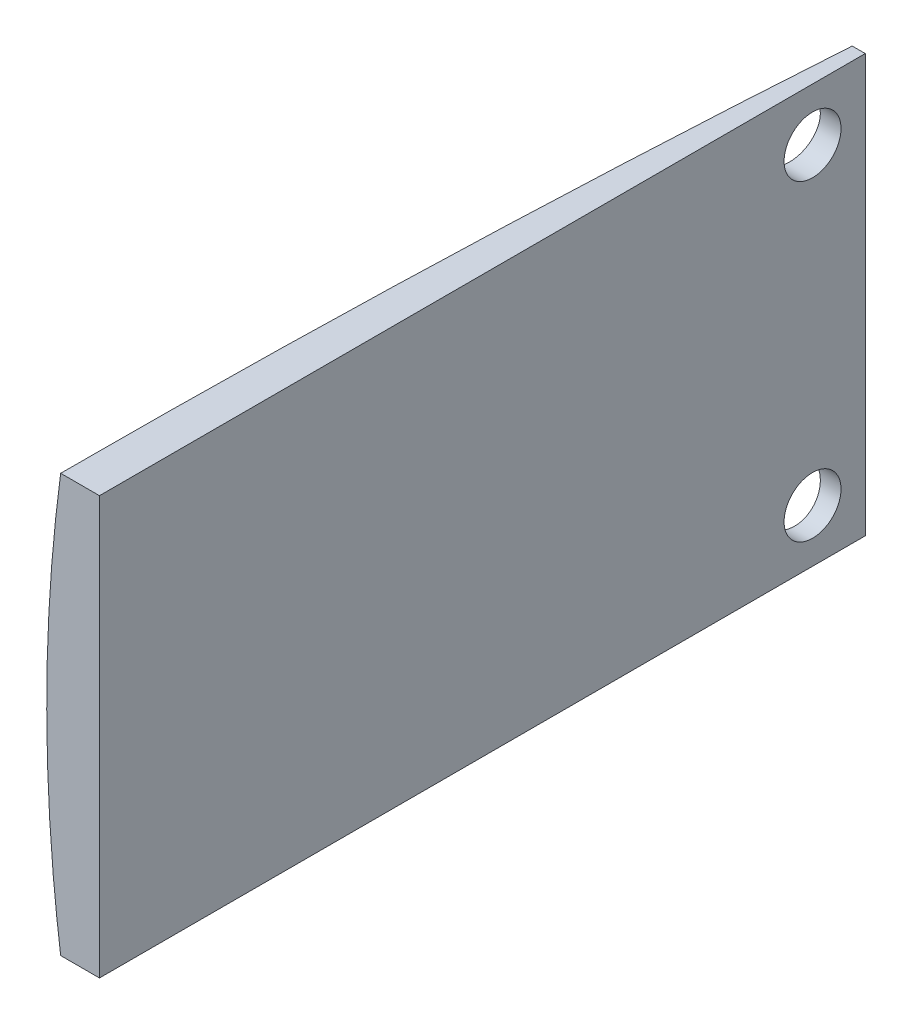
ISO-10303-21;
HEADER;
FILE_DESCRIPTION(('STEP AP214'),'2;1');
FILE_NAME('part.step','',(''),(''),'','','');
FILE_SCHEMA(('AUTOMOTIVE_DESIGN { 1 0 10303 214 1 1 1 1 }'));
ENDSEC;
DATA;
#1=APPLICATION_CONTEXT('core data for automotive mechanical design processes');
#2=APPLICATION_PROTOCOL_DEFINITION('international standard','automotive_design',2000,#1);
#3=PRODUCT_CONTEXT('',#1,'mechanical');
#4=PRODUCT('Part','Part','',(#3));
#5=PRODUCT_RELATED_PRODUCT_CATEGORY('part','',(#4));
#6=PRODUCT_DEFINITION_FORMATION('','',#4);
#7=PRODUCT_DEFINITION_CONTEXT('part definition',#1,'design');
#8=PRODUCT_DEFINITION('design','',#6,#7);
#9=PRODUCT_DEFINITION_SHAPE('','',#8);
#10=(LENGTH_UNIT() NAMED_UNIT(*) SI_UNIT(.MILLI.,.METRE.));
#11=(NAMED_UNIT(*) PLANE_ANGLE_UNIT() SI_UNIT($,.RADIAN.));
#12=(NAMED_UNIT(*) SI_UNIT($,.STERADIAN.) SOLID_ANGLE_UNIT());
#13=UNCERTAINTY_MEASURE_WITH_UNIT(LENGTH_MEASURE(1.E-05),#10,'distance_accuracy_value','');
#14=(GEOMETRIC_REPRESENTATION_CONTEXT(3) GLOBAL_UNCERTAINTY_ASSIGNED_CONTEXT((#13)) GLOBAL_UNIT_ASSIGNED_CONTEXT((#10,
#11,#12)) REPRESENTATION_CONTEXT('',''));
#15=CARTESIAN_POINT('',(0.,0.,0.));
#16=DIRECTION('',(0.,0.,1.));
#17=DIRECTION('',(1.,0.,0.));
#18=AXIS2_PLACEMENT_3D('',#15,#16,#17);
#19=CARTESIAN_POINT('',(-1.2E-05,25.146,0.));
#20=DIRECTION('',(0.,1.,0.));
#21=DIRECTION('',(0.,0.,1.));
#22=AXIS2_PLACEMENT_3D('',#19,#20,#21);
#23=PLANE('',#22);
#24=CARTESIAN_POINT('',(1372.87,25.1460000000003,0.));
#25=DIRECTION('',(0.,-1.,0.));
#26=DIRECTION('',(1.,0.,0.));
#27=AXIS2_PLACEMENT_3D('',#24,#25,#26);
#28=CIRCLE('',#27,1371.19541959824);
#29=CARTESIAN_POINT('',(4.7780184712767,25.146,-92.2019999999999));
#30=VERTEX_POINT('',#29);
#31=CARTESIAN_POINT('',(1.67458040176172,25.146,0.));
#32=VERTEX_POINT('',#31);
#33=EDGE_CURVE('E94',#30,#32,#28,.F.);
#34=ORIENTED_EDGE('',*,*,#33,.T.);
#35=DIRECTION('',(1.,0.,0.));
#36=VECTOR('',#35,1.);
#37=CARTESIAN_POINT('',(-1.2E-05,25.146,0.));
#38=LINE('',#37,#36);
#39=CARTESIAN_POINT('',(6.35,25.146,0.));
#40=VERTEX_POINT('',#39);
#41=EDGE_CURVE('E127',#32,#40,#38,.T.);
#42=ORIENTED_EDGE('',*,*,#41,.T.);
#43=DIRECTION('',(0.,0.,1.));
#44=VECTOR('',#43,1.);
#45=CARTESIAN_POINT('',(6.35,25.146,-92.2020000000001));
#46=LINE('',#45,#44);
#47=CARTESIAN_POINT('',(6.35,25.146,-92.2020000000001));
#48=VERTEX_POINT('',#47);
#49=EDGE_CURVE('E135',#48,#40,#46,.T.);
#50=ORIENTED_EDGE('',*,*,#49,.F.);
#51=DIRECTION('',(1.,0.,0.));
#52=VECTOR('',#51,1.);
#53=CARTESIAN_POINT('',(-1.2E-05,25.146,-92.2019999999999));
#54=LINE('',#53,#52);
#55=EDGE_CURVE('E145',#30,#48,#54,.T.);
#56=ORIENTED_EDGE('',*,*,#55,.F.);
#57=EDGE_LOOP('',(#34,#42,#50,#56));
#58=FACE_BOUND('',#57,.T.);
#59=ADVANCED_FACE('F84',(#58),#23,.T.);
#60=CARTESIAN_POINT('',(-1.2E-05,-25.146,0.));
#61=DIRECTION('',(0.,1.,0.));
#62=DIRECTION('',(0.,0.,1.));
#63=AXIS2_PLACEMENT_3D('',#60,#61,#62);
#64=PLANE('',#63);
#65=DIRECTION('',(1.,0.,0.));
#66=VECTOR('',#65,1.);
#67=CARTESIAN_POINT('',(-1.2E-05,-25.146,0.));
#68=LINE('',#67,#66);
#69=CARTESIAN_POINT('',(1.67458040176194,-25.146,0.));
#70=VERTEX_POINT('',#69);
#71=CARTESIAN_POINT('',(6.35,-25.146,0.));
#72=VERTEX_POINT('',#71);
#73=EDGE_CURVE('E100',#70,#72,#68,.T.);
#74=ORIENTED_EDGE('',*,*,#73,.F.);
#75=CARTESIAN_POINT('',(1372.87,-25.1459999999997,0.));
#76=DIRECTION('',(0.,-1.,0.));
#77=DIRECTION('',(1.,0.,0.));
#78=AXIS2_PLACEMENT_3D('',#75,#76,#77);
#79=CIRCLE('',#78,1371.19541959824);
#80=CARTESIAN_POINT('',(4.77801847127712,-25.1459999999997,-92.2019999999999));
#81=VERTEX_POINT('',#80);
#82=EDGE_CURVE('E151',#81,#70,#79,.F.);
#83=ORIENTED_EDGE('',*,*,#82,.F.);
#84=DIRECTION('',(1.,0.,0.));
#85=VECTOR('',#84,1.);
#86=CARTESIAN_POINT('',(-1.2E-05,-25.146,-92.2019999999999));
#87=LINE('',#86,#85);
#88=CARTESIAN_POINT('',(6.35,-25.146,-92.2020000000001));
#89=VERTEX_POINT('',#88);
#90=EDGE_CURVE('E142',#81,#89,#87,.T.);
#91=ORIENTED_EDGE('',*,*,#90,.T.);
#92=DIRECTION('',(0.,0.,-1.));
#93=VECTOR('',#92,1.);
#94=CARTESIAN_POINT('',(6.35,-25.146,-92.2020000000001));
#95=LINE('',#94,#93);
#96=EDGE_CURVE('E147',#72,#89,#95,.T.);
#97=ORIENTED_EDGE('',*,*,#96,.F.);
#98=EDGE_LOOP('',(#74,#83,#91,#97));
#99=FACE_BOUND('',#98,.T.);
#100=ADVANCED_FACE('F168',(#99),#64,.F.);
#101=CARTESIAN_POINT('',(1372.87,4.16333634234434E-13,0.));
#102=DIRECTION('',(0.,0.,1.));
#103=DIRECTION('',(-1.,0.,0.));
#104=AXIS2_PLACEMENT_3D('',#101,#102,#103);
#105=ELLIPSE('',#104,1372.87,509.27);
#106=TRIMMED_CURVE('',#105,(PARAMETER_VALUE(4.71238898038469)),
(PARAMETER_VALUE(7.85398163397448)),.T.,.PARAMETER.);
#107=CARTESIAN_POINT('',(1372.87,-509.27,0.));
#108=DIRECTION('',(0.,-1.,0.));
#109=AXIS1_PLACEMENT('',#107,#108);
#110=SURFACE_OF_REVOLUTION('',#106,#109);
#111=CARTESIAN_POINT('',(3.84350644112894,-18.7960000000001,-89.2810000000001));
#112=CARTESIAN_POINT('',(3.82416979745418,-18.6021967518642,-89.2809913131429));
#113=CARTESIAN_POINT('',(3.80405403535252,-18.408325517274,-89.2645149146861));
#114=CARTESIAN_POINT('',(3.76282676595103,-18.0260814130698,-89.1990814083742));
#115=CARTESIAN_POINT('',(3.74171403802477,-17.837715766031,-89.1500834722642));
#116=CARTESIAN_POINT('',(3.69905601555515,-17.4720901472664,-89.021045271072));
#117=CARTESIAN_POINT('',(3.67751097428364,-17.294823910099,-88.9410227057759));
#118=CARTESIAN_POINT('',(3.63449777940847,-16.956377174898,-88.7522365646787));
#119=CARTESIAN_POINT('',(3.61302960735217,-16.7951925264427,-88.6434804311602));
#120=CARTESIAN_POINT('',(3.57062681355467,-16.4932591267592,-88.4001483641188));
#121=CARTESIAN_POINT('',(3.54969284158904,-16.3525343683172,-88.2655425396562));
#122=CARTESIAN_POINT('',(3.50884976266647,-16.0957840424969,-87.9743921720791));
#123=CARTESIAN_POINT('',(3.48894069579336,-15.9797594405814,-87.8178467718022));
#124=CARTESIAN_POINT('',(3.45062417577412,-15.7759495494466,-87.4875239872384));
#125=CARTESIAN_POINT('',(3.43221436988144,-15.6881193524145,-87.3137745888402));
#126=CARTESIAN_POINT('',(3.3972855095271,-15.5430310464798,-86.9537691209872));
#127=CARTESIAN_POINT('',(3.380766417403,-15.4857723285193,-86.7675133007737));
#128=CARTESIAN_POINT('',(3.35008592376041,-15.4037203795928,-86.3885750550185));
#129=CARTESIAN_POINT('',(3.33591540430273,-15.3787989005092,-86.1959211435209));
#130=CARTESIAN_POINT('',(3.31023180340657,-15.3618059998273,-85.8089927785232));
#131=CARTESIAN_POINT('',(3.29871864489868,-15.3697336254051,-85.6147183721903));
#132=CARTESIAN_POINT('',(3.27875079386526,-15.418167435771,-85.2311425755838));
#133=CARTESIAN_POINT('',(3.2702805079979,-15.4585039906361,-85.0418205781691));
#134=CARTESIAN_POINT('',(3.25661671873342,-15.5704563910622,-84.6725375020955));
#135=CARTESIAN_POINT('',(3.25142312268059,-15.6420713520596,-84.4925761588752));
#136=CARTESIAN_POINT('',(3.24457219734608,-15.8141463857437,-84.1480366813344));
#137=CARTESIAN_POINT('',(3.24289786438313,-15.9144650873139,-83.983388269586));
#138=CARTESIAN_POINT('',(3.24319794834599,-16.1412337785769,-83.6732009837098));
#139=CARTESIAN_POINT('',(3.24517228839113,-16.2676832176227,-83.5276617070053));
#140=CARTESIAN_POINT('',(3.25282782939993,-16.5427290946912,-83.2601829428099));
#141=CARTESIAN_POINT('',(3.25849940006001,-16.6912672238215,-83.1381832080403));
#142=CARTESIAN_POINT('',(3.27349730518516,-17.0064809541096,-82.9207333783765));
#143=CARTESIAN_POINT('',(3.28282363772124,-17.1731565456944,-82.8252832694694));
#144=CARTESIAN_POINT('',(3.30498094945711,-17.520107410769,-82.6634537908069));
#145=CARTESIAN_POINT('',(3.31781635581612,-17.7003996540926,-82.5971114215833));
#146=CARTESIAN_POINT('',(3.34669520407488,-18.0692768236335,-82.4954363188668));
#147=CARTESIAN_POINT('',(3.36273872283217,-18.257861948441,-82.4601043284065));
#148=CARTESIAN_POINT('',(3.39771307070351,-18.6390490256929,-82.4212117203763));
#149=CARTESIAN_POINT('',(3.41665898034066,-18.8316671383574,-82.4178231876746));
#150=CARTESIAN_POINT('',(3.45683769175307,-19.2145254434208,-82.4432335056031));
#151=CARTESIAN_POINT('',(3.47807058775928,-19.404765537477,-82.4720336829673));
#152=CARTESIAN_POINT('',(3.52235548402294,-19.7790018187904,-82.5612510064372));
#153=CARTESIAN_POINT('',(3.54542001433735,-19.9629399829813,-82.6219053469163));
#154=CARTESIAN_POINT('',(3.59249956045478,-20.3179142601414,-82.7731940468349));
#155=CARTESIAN_POINT('',(3.61651461325151,-20.4889498701972,-82.8638295741347));
#156=CARTESIAN_POINT('',(3.66486142805937,-20.8143310435793,-83.0731469919832));
#157=CARTESIAN_POINT('',(3.68919422533105,-20.9685706029349,-83.1919934754542));
#158=CARTESIAN_POINT('',(3.73721964680474,-21.2548116375953,-83.454095637418));
#159=CARTESIAN_POINT('',(3.76091226174127,-21.3868127911837,-83.5973516689764));
#160=CARTESIAN_POINT('',(3.80687266779825,-21.624895441691,-83.9043957570261));
#161=CARTESIAN_POINT('',(3.8291392242454,-21.7309546963475,-84.0682012516168));
#162=CARTESIAN_POINT('',(3.87146256297029,-21.9138897248772,-84.4116339863735));
#163=CARTESIAN_POINT('',(3.89151939736879,-21.9907661871903,-84.5912608531805));
#164=CARTESIAN_POINT('',(3.92864334798174,-22.1126876211141,-84.9602674717372));
#165=CARTESIAN_POINT('',(3.94572536976943,-22.1578949374637,-85.1495920631484));
#166=CARTESIAN_POINT('',(3.97646100435481,-22.215680745214,-85.5334303364292));
#167=CARTESIAN_POINT('',(3.99011477243594,-22.2282607147179,-85.7279437828268));
#168=CARTESIAN_POINT('',(4.01346780013085,-22.2203340254297,-86.1148913839218));
#169=CARTESIAN_POINT('',(4.02319932942697,-22.2001045410049,-86.3073292749409));
#170=CARTESIAN_POINT('',(4.03860608122912,-22.127562327081,-86.686227176914));
#171=CARTESIAN_POINT('',(4.04428147050958,-22.0752509168439,-86.8726874333464));
#172=CARTESIAN_POINT('',(4.05144731267281,-21.9404669947227,-87.2329815545217));
#173=CARTESIAN_POINT('',(4.0529663582659,-21.8582049861288,-87.4068936318116));
#174=CARTESIAN_POINT('',(4.05195481242686,-21.665810151487,-87.7385247396477));
#175=CARTESIAN_POINT('',(4.04942445194082,-21.555678915181,-87.8962446931185));
#176=CARTESIAN_POINT('',(4.0405186548523,-21.3109549947946,-88.1907224815361));
#177=CARTESIAN_POINT('',(4.03415107947915,-21.1764127139631,-88.3275224583772));
#178=CARTESIAN_POINT('',(4.0178883044561,-20.8865167193227,-88.5767615725779));
#179=CARTESIAN_POINT('',(4.00799218313595,-20.7311575746907,-88.689194332775));
#180=CARTESIAN_POINT('',(3.98503779767561,-20.4034651892062,-88.8869422981466));
#181=CARTESIAN_POINT('',(3.97196758709106,-20.2310693157188,-88.9721521696573));
#182=CARTESIAN_POINT('',(3.94317136265055,-19.8748139154431,-89.1124869234037));
#183=CARTESIAN_POINT('',(3.9274484677542,-19.6909680096368,-89.1676468192129));
#184=CARTESIAN_POINT('',(3.90021478094734,-19.3876440253995,-89.2316725193735));
#185=CARTESIAN_POINT('',(3.88935278791394,-19.2700493435361,-89.2501526520728));
#186=CARTESIAN_POINT('',(3.86692698978308,-19.0336449634025,-89.2748190685457));
#187=CARTESIAN_POINT('',(3.85536318321527,-18.9148352625871,-89.2810053265617));
#188=CARTESIAN_POINT('',(3.84350644112894,-18.7960000000001,-89.2810000000001));
#189=B_SPLINE_CURVE_WITH_KNOTS('',3,(#111,#112,#113,#114,#115,#116,#117,#118,#119,#120,#121,
#122,#123,#124,#125,#126,#127,#128,#129,#130,#131,#132,#133,#134,#135,#136,#137,#138,#139,#140,
#141,#142,#143,#144,#145,#146,#147,#148,#149,#150,#151,#152,#153,#154,#155,#156,#157,#158,#159,
#160,#161,#162,#163,#164,#165,#166,#167,#168,#169,#170,#171,#172,#173,#174,#175,#176,#177,#178,
#179,#180,#181,#182,#183,#184,#185,#186,#187,#188),.UNSPECIFIED.,.T.,.F.,(4,2,2,2,2,2,2,2,2,2,2,
2,2,2,2,2,2,2,2,2,2,2,2,2,2,2,2,2,2,2,2,2,2,2,2,2,2,2,4),(0.,0.583859197381522,1.16845277439552,
1.75271332595525,2.33682269626621,2.92161160538329,3.50642336812888,4.09029897173662,
4.67416294269702,5.25570418422004,5.83722855762474,6.41572887872768,6.99421284071454,
7.56989531186605,8.14556565303274,8.71974248520838,9.29391901433181,9.8688233126767,
10.4437413857968,11.0217548824091,11.5997922040934,12.1821960792768,12.7646226435712,
13.3505346425141,13.9364551169445,14.5228762051214,15.1092834584081,15.6926621838752,
16.2760144803164,16.8544642338192,17.4328902021043,18.0073268827774,18.5817308032961,
19.1549619350964,19.7283429069699,20.3039163243784,20.8788176540056,21.2368246344548,
21.5948323649858),.UNSPECIFIED.);
#190=CARTESIAN_POINT('',(3.84350644112894,-18.7960000000001,-89.2810000000001));
#191=VERTEX_POINT('',#190);
#192=EDGE_CURVE('E237',#191,#191,#189,.T.);
#193=ORIENTED_EDGE('',*,*,#192,.T.);
#194=EDGE_LOOP('',(#193));
#195=FACE_BOUND('',#194,.T.);
#196=CARTESIAN_POINT('',(3.84350644112893,18.7959999999999,-89.2810000000001));
#197=CARTESIAN_POINT('',(3.86271226181631,18.9884953562008,-89.2809917692394));
#198=CARTESIAN_POINT('',(3.88117712961673,19.1812007655573,-89.2647381844845));
#199=CARTESIAN_POINT('',(3.91606436157229,19.5614828574912,-89.2000377571739));
#200=CARTESIAN_POINT('',(3.93248436016621,19.7490534078564,-89.1515540332081));
#201=CARTESIAN_POINT('',(3.96272663881641,20.1135393933856,-89.0236570079777));
#202=CARTESIAN_POINT('',(3.97654945525488,20.2904570235003,-88.9442501035443));
#203=CARTESIAN_POINT('',(4.00109467569637,20.6285203824212,-88.7566978986505));
#204=CARTESIAN_POINT('',(4.01181787153147,20.7896701323344,-88.6485599514212));
#205=CARTESIAN_POINT('',(4.02968899466966,21.0908736554655,-88.4071273516107));
#206=CARTESIAN_POINT('',(4.03685319598981,21.2310213687271,-88.2739511194651));
#207=CARTESIAN_POINT('',(4.04733798657052,21.4870462489509,-87.9858797354929));
#208=CARTESIAN_POINT('',(4.05065856689832,21.6029233595063,-87.8309845331911));
#209=CARTESIAN_POINT('',(4.05322477785549,21.8064588304012,-87.5048510423473));
#210=CARTESIAN_POINT('',(4.0524935431695,21.8942743750866,-87.3337110108302));
#211=CARTESIAN_POINT('',(4.04692845111743,22.0400887403866,-86.9792340080502));
#212=CARTESIAN_POINT('',(4.04209467802054,22.0980881734071,-86.7958972873876));
#213=CARTESIAN_POINT('',(4.02840815143735,22.1825942953944,-86.4225963382514));
#214=CARTESIAN_POINT('',(4.01956254426626,22.2091566810591,-86.2326444465331));
#215=CARTESIAN_POINT('',(3.99808140125354,22.2303168275449,-85.8511851850296));
#216=CARTESIAN_POINT('',(3.9854458213927,22.2249142170901,-85.6596777972031));
#217=CARTESIAN_POINT('',(3.95670626649934,22.1823347104155,-85.2797657491229));
#218=CARTESIAN_POINT('',(3.94058944175397,22.1450385398228,-85.0913754453234));
#219=CARTESIAN_POINT('',(3.90542921791826,22.0396912932162,-84.7236890478606));
#220=CARTESIAN_POINT('',(3.88638569905393,21.971638958295,-84.5443933267898));
#221=CARTESIAN_POINT('',(3.84583667598,21.8061404052524,-84.1984751516541));
#222=CARTESIAN_POINT('',(3.8243130330572,21.7084678267783,-84.0319631285569));
#223=CARTESIAN_POINT('',(3.77964680442421,21.4867483206123,-83.7177818460265));
#224=CARTESIAN_POINT('',(3.75650414427699,21.3627001797241,-83.5701134538436));
#225=CARTESIAN_POINT('',(3.70918639373177,21.0906628747471,-83.2966026499946));
#226=CARTESIAN_POINT('',(3.68500462370725,20.9424933797286,-83.1709407137476));
#227=CARTESIAN_POINT('',(3.63658993388746,20.627099619695,-82.9463860426252));
#228=CARTESIAN_POINT('',(3.6123570127067,20.459874831868,-82.8474940424766));
#229=CARTESIAN_POINT('',(3.56455193025834,20.1104423244286,-82.6789828804153));
#230=CARTESIAN_POINT('',(3.54098239950801,19.9281838640467,-82.609468142319));
#231=CARTESIAN_POINT('',(3.49535417369743,19.5543526041684,-82.5022609392212));
#232=CARTESIAN_POINT('',(3.47329546769284,19.3627798721613,-82.4645682436799));
#233=CARTESIAN_POINT('',(3.43143039621584,18.9762813317629,-82.422242906247));
#234=CARTESIAN_POINT('',(3.41161831224801,18.7813655598614,-82.417524385795));
#235=CARTESIAN_POINT('',(3.37476488888688,18.3932862539023,-82.4411863952071));
#236=CARTESIAN_POINT('',(3.35772345073321,18.2001226576199,-82.4695657449943));
#237=CARTESIAN_POINT('',(3.32698447695801,17.8224662239907,-82.5584238793958));
#238=CARTESIAN_POINT('',(3.31326463506714,17.6379226686421,-82.6186793597014));
#239=CARTESIAN_POINT('',(3.28934711598082,17.2814389000656,-82.7695334513615));
#240=CARTESIAN_POINT('',(3.27914929055905,17.1094981566802,-82.8601307854437));
#241=CARTESIAN_POINT('',(3.26253337742514,16.7844233305733,-83.0683708589751));
#242=CARTESIAN_POINT('',(3.25608841229946,16.6311618907607,-83.1858126764858));
#243=CARTESIAN_POINT('',(3.24693101182293,16.3464303852241,-83.444785569593));
#244=CARTESIAN_POINT('',(3.24421847566907,16.214959731073,-83.586315994504));
#245=CARTESIAN_POINT('',(3.24248163798573,15.9780923177249,-83.8887922300999));
#246=CARTESIAN_POINT('',(3.24344201246442,15.8725891763333,-84.04965466689));
#247=CARTESIAN_POINT('',(3.24887157907232,15.6899359124945,-84.38668618694));
#248=CARTESIAN_POINT('',(3.25334075101971,15.6127856269717,-84.5628551821547));
#249=CARTESIAN_POINT('',(3.26556439458236,15.4889805965208,-84.9255118322421));
#250=CARTESIAN_POINT('',(3.27331922850989,15.4423292161719,-85.1120006231135));
#251=CARTESIAN_POINT('',(3.29182939752899,15.3807888892312,-85.4900003310377));
#252=CARTESIAN_POINT('',(3.30258478114085,15.3659004562949,-85.6815113292564));
#253=CARTESIAN_POINT('',(3.32680996729525,15.3682302838467,-86.0648403419749));
#254=CARTESIAN_POINT('',(3.34028918242755,15.385561635709,-86.2566570677842));
#255=CARTESIAN_POINT('',(3.36957484618389,15.4519764433982,-86.6345279048942));
#256=CARTESIAN_POINT('',(3.38538135809466,15.5010607628142,-86.8205818593197));
#257=CARTESIAN_POINT('',(3.41902213017551,15.6298528131588,-87.182663056399));
#258=CARTESIAN_POINT('',(3.43686640461504,15.7097168009231,-87.3586337870988));
#259=CARTESIAN_POINT('',(3.47410517672298,15.8977199355029,-87.6945700801279));
#260=CARTESIAN_POINT('',(3.49349965590655,16.0058587452009,-87.8545358332513));
#261=CARTESIAN_POINT('',(3.5335081216539,16.2479050246736,-88.154739863754));
#262=CARTESIAN_POINT('',(3.55412756767905,16.3819349540939,-88.2948786782689));
#263=CARTESIAN_POINT('',(3.59605156168066,16.6716385945936,-88.5506045071951));
#264=CARTESIAN_POINT('',(3.61735629094633,16.8273180697893,-88.666184962243));
#265=CARTESIAN_POINT('',(3.6602485278621,17.15649305055,-88.8698933702761));
#266=CARTESIAN_POINT('',(3.6818368068416,17.3300546199136,-88.9579142937149));
#267=CARTESIAN_POINT('',(3.72469247595366,17.6894413819755,-89.1033168113762));
#268=CARTESIAN_POINT('',(3.74596021348956,17.8752519175878,-89.1607343037916));
#269=CARTESIAN_POINT('',(3.78001343571083,18.1845078176723,-89.2282772513338));
#270=CARTESIAN_POINT('',(3.79305648960988,18.305909248685,-89.2480186790095));
#271=CARTESIAN_POINT('',(3.81866927512186,18.550178552509,-89.2743826904942));
#272=CARTESIAN_POINT('',(3.83123900612049,18.6730464272233,-89.2810052572772));
#273=CARTESIAN_POINT('',(3.84350644112893,18.7959999999999,-89.2810000000001));
#274=B_SPLINE_CURVE_WITH_KNOTS('',3,(#196,#197,#198,#199,#200,#201,#202,#203,#204,#205,#206,
#207,#208,#209,#210,#211,#212,#213,#214,#215,#216,#217,#218,#219,#220,#221,#222,#223,#224,#225,
#226,#227,#228,#229,#230,#231,#232,#233,#234,#235,#236,#237,#238,#239,#240,#241,#242,#243,#244,
#245,#246,#247,#248,#249,#250,#251,#252,#253,#254,#255,#256,#257,#258,#259,#260,#261,#262,#263,
#264,#265,#266,#267,#268,#269,#270,#271,#272,#273),.UNSPECIFIED.,.T.,.F.,(4,2,2,2,2,2,2,2,2,2,2,
2,2,2,2,2,2,2,2,2,2,2,2,2,2,2,2,2,2,2,2,2,2,2,2,2,2,2,4),(0.,0.579905766158203,1.16047627173083,
1.74092674306254,2.3212288006419,2.8988523405832,3.47647722294945,4.05080744620893,
4.62512587258444,5.19842525434185,5.77173129502812,6.34719078833844,6.92267383841597,
7.50267060940894,8.08269406427645,8.66727170686142,9.25186539212051,9.83851993137081,
10.4251702204774,11.0102920552279,11.5953930285854,12.176448394352,12.7574793030519,
13.3342960837084,13.9110972857663,14.4854946081518,15.0598886267569,15.6343460006887,
16.2088126644032,16.7852995128999,17.3618020408357,17.9412706493124,18.5207323491652,
19.1030050322521,19.6854330412867,20.2700956756319,20.8540709758655,21.2244767596415,
21.5948830241362),.UNSPECIFIED.);
#275=CARTESIAN_POINT('',(3.84350644112893,18.7959999999999,-89.2810000000001));
#276=VERTEX_POINT('',#275);
#277=EDGE_CURVE('E244',#276,#276,#274,.T.);
#278=ORIENTED_EDGE('',*,*,#277,.T.);
#279=EDGE_LOOP('',(#278));
#280=FACE_BOUND('',#279,.T.);
#281=CARTESIAN_POINT('',(1372.87,4.16333634234434E-13,0.));
#282=DIRECTION('',(0.,0.,1.));
#283=DIRECTION('',(-1.,0.,0.));
#284=AXIS2_PLACEMENT_3D('',#281,#282,#283);
#285=ELLIPSE('',#284,1372.87,509.27);
#286=EDGE_CURVE('E137',#32,#70,#285,.T.);
#287=ORIENTED_EDGE('',*,*,#286,.F.);
#288=ORIENTED_EDGE('',*,*,#33,.F.);
#289=CARTESIAN_POINT('',(4.7780184712767,25.146,-92.2019999999999));
#290=CARTESIAN_POINT('',(4.59166788954076,23.7509410775317,-92.2019999999999));
#291=CARTESIAN_POINT('',(4.42060734687266,22.3538353400213,-92.2019999999999));
#292=CARTESIAN_POINT('',(4.10970318609753,19.5596122735176,-92.2019999999999));
#293=CARTESIAN_POINT('',(3.96978429647137,18.162503317759,-92.2019999999999));
#294=CARTESIAN_POINT('',(3.72113135185098,15.368275175018,-92.2019999999999));
#295=CARTESIAN_POINT('',(3.61233662996028,13.9711613899426,-92.2019999999999));
#296=CARTESIAN_POINT('',(3.42589241107428,11.1769289071129,-92.2019999999999));
#297=CARTESIAN_POINT('',(3.34819715871109,9.77981326328065,-92.2019999999999));
#298=CARTESIAN_POINT('',(3.22392182470786,6.98557999081025,-92.2019999999999));
#299=CARTESIAN_POINT('',(3.17731110585369,5.58846372535655,-92.2019999999999));
#300=CARTESIAN_POINT('',(3.11517989386899,2.79423141199115,-92.2019999999999));
#301=CARTESIAN_POINT('',(3.09964402933586,1.39711570599561,-92.2019999999999));
#302=CARTESIAN_POINT('',(3.09964402933586,-1.39711570599546,-92.2019999999999));
#303=CARTESIAN_POINT('',(3.11517989386898,-2.794231411991,-92.2019999999999));
#304=CARTESIAN_POINT('',(3.17731110585369,-5.5884637253564,-92.2019999999999));
#305=CARTESIAN_POINT('',(3.22392182470787,-6.9855799908101,-92.2019999999999));
#306=CARTESIAN_POINT('',(3.34819715871109,-9.7798132632805,-92.2019999999999));
#307=CARTESIAN_POINT('',(3.42589241107429,-11.1769289071127,-92.2019999999999));
#308=CARTESIAN_POINT('',(3.61233662996028,-13.9711613899424,-92.2019999999999));
#309=CARTESIAN_POINT('',(3.72113135185099,-15.3682751750178,-92.2019999999999));
#310=CARTESIAN_POINT('',(3.96978429647138,-18.1625033177588,-92.2019999999999));
#311=CARTESIAN_POINT('',(4.10970318609755,-19.5596122735174,-92.2019999999999));
#312=CARTESIAN_POINT('',(4.42060734687267,-22.3538353400211,-92.2019999999999));
#313=CARTESIAN_POINT('',(4.59166788954076,-23.7509410775315,-92.2019999999999));
#314=CARTESIAN_POINT('',(4.77801847127669,-25.1459999999999,-92.2019999999999));
#315=B_SPLINE_CURVE_WITH_KNOTS('',3,(#289,#290,#291,#292,#293,#294,#295,#296,#297,#298,#299,
#300,#301,#302,#303,#304,#305,#306,#307,#308,#309,#310,#311,#312,#313,#314),.UNSPECIFIED.,.F.,
.F.,(4,2,2,2,2,2,2,2,2,2,2,2,4),(0.,4.22227231704978,8.43422552238614,12.6379120074765,
16.8353908464465,21.0287264716252,25.2199873193706,29.411248167116,33.6045837922947,
37.8020626312646,42.005749116355,46.2177023216914,50.4399746387412),.UNSPECIFIED.);
#316=EDGE_CURVE('E108',#30,#81,#315,.T.);
#317=ORIENTED_EDGE('',*,*,#316,.T.);
#318=ORIENTED_EDGE('',*,*,#82,.T.);
#319=EDGE_LOOP('',(#287,#288,#317,#318));
#320=FACE_BOUND('',#319,.T.);
#321=ADVANCED_FACE('F86',(#195,#280,#320),#110,.T.);
#322=CARTESIAN_POINT('',(6.35,0.,0.));
#323=DIRECTION('',(-1.,0.,0.));
#324=DIRECTION('',(0.,0.,1.));
#325=AXIS2_PLACEMENT_3D('',#322,#323,#324);
#326=PLANE('',#325);
#327=CARTESIAN_POINT('',(6.35,-18.796,-85.8520000000001));
#328=DIRECTION('',(1.,0.,0.));
#329=DIRECTION('',(0.,0.,-1.));
#330=AXIS2_PLACEMENT_3D('',#327,#328,#329);
#331=CIRCLE('',#330,3.429);
#332=CARTESIAN_POINT('',(6.35,-18.796,-89.2810000000001));
#333=VERTEX_POINT('',#332);
#334=EDGE_CURVE('E245',#333,#333,#331,.T.);
#335=ORIENTED_EDGE('',*,*,#334,.F.);
#336=EDGE_LOOP('',(#335));
#337=FACE_BOUND('',#336,.T.);
#338=CARTESIAN_POINT('',(6.35,18.796,-85.8520000000001));
#339=DIRECTION('',(1.,0.,0.));
#340=DIRECTION('',(0.,0.,-1.));
#341=AXIS2_PLACEMENT_3D('',#338,#339,#340);
#342=CIRCLE('',#341,3.429);
#343=CARTESIAN_POINT('',(6.35,18.796,-89.2810000000001));
#344=VERTEX_POINT('',#343);
#345=EDGE_CURVE('E246',#344,#344,#342,.T.);
#346=ORIENTED_EDGE('',*,*,#345,.F.);
#347=EDGE_LOOP('',(#346));
#348=FACE_BOUND('',#347,.T.);
#349=DIRECTION('',(0.,1.,0.));
#350=VECTOR('',#349,1.);
#351=CARTESIAN_POINT('',(6.35,0.,0.));
#352=LINE('',#351,#350);
#353=EDGE_CURVE('E13',#72,#40,#352,.T.);
#354=ORIENTED_EDGE('',*,*,#353,.F.);
#355=ORIENTED_EDGE('',*,*,#96,.T.);
#356=DIRECTION('',(0.,1.,0.));
#357=VECTOR('',#356,1.);
#358=CARTESIAN_POINT('',(6.35,25.146,-92.2020000000001));
#359=LINE('',#358,#357);
#360=EDGE_CURVE('E141',#89,#48,#359,.T.);
#361=ORIENTED_EDGE('',*,*,#360,.T.);
#362=ORIENTED_EDGE('',*,*,#49,.T.);
#363=EDGE_LOOP('',(#354,#355,#361,#362));
#364=FACE_BOUND('',#363,.T.);
#365=ADVANCED_FACE('F139',(#337,#348,#364),#326,.F.);
#366=CARTESIAN_POINT('',(-1.2E-05,0.,-92.2019999999999));
#367=DIRECTION('',(0.,0.,1.));
#368=DIRECTION('',(1.,0.,0.));
#369=AXIS2_PLACEMENT_3D('',#366,#367,#368);
#370=PLANE('',#369);
#371=ORIENTED_EDGE('',*,*,#55,.T.);
#372=ORIENTED_EDGE('',*,*,#360,.F.);
#373=ORIENTED_EDGE('',*,*,#90,.F.);
#374=ORIENTED_EDGE('',*,*,#316,.F.);
#375=EDGE_LOOP('',(#371,#372,#373,#374));
#376=FACE_BOUND('',#375,.T.);
#377=ADVANCED_FACE('F161',(#376),#370,.F.);
#378=CARTESIAN_POINT('',(-3.55883561078287,-18.796,-85.8520000000001));
#379=DIRECTION('',(1.,0.,0.));
#380=DIRECTION('',(0.,0.,-1.));
#381=AXIS2_PLACEMENT_3D('',#378,#379,#380);
#382=CYLINDRICAL_SURFACE('',#381,3.429);
#383=ORIENTED_EDGE('',*,*,#334,.T.);
#384=EDGE_LOOP('',(#383));
#385=FACE_BOUND('',#384,.T.);
#386=ORIENTED_EDGE('',*,*,#192,.F.);
#387=EDGE_LOOP('',(#386));
#388=FACE_BOUND('',#387,.T.);
#389=ADVANCED_FACE('F166',(#385,#388),#382,.F.);
#390=CARTESIAN_POINT('',(-3.55883561078287,18.796,-85.8520000000001));
#391=DIRECTION('',(1.,0.,0.));
#392=DIRECTION('',(0.,0.,-1.));
#393=AXIS2_PLACEMENT_3D('',#390,#391,#392);
#394=CYLINDRICAL_SURFACE('',#393,3.429);
#395=ORIENTED_EDGE('',*,*,#345,.T.);
#396=EDGE_LOOP('',(#395));
#397=FACE_BOUND('',#396,.T.);
#398=ORIENTED_EDGE('',*,*,#277,.F.);
#399=EDGE_LOOP('',(#398));
#400=FACE_BOUND('',#399,.T.);
#401=ADVANCED_FACE('F180',(#397,#400),#394,.F.);
#402=CARTESIAN_POINT('',(0.,0.,0.));
#403=DIRECTION('',(0.,0.,1.));
#404=DIRECTION('',(1.,0.,0.));
#405=AXIS2_PLACEMENT_3D('',#402,#403,#404);
#406=PLANE('',#405);
#407=ORIENTED_EDGE('',*,*,#286,.T.);
#408=ORIENTED_EDGE('',*,*,#73,.T.);
#409=ORIENTED_EDGE('',*,*,#353,.T.);
#410=ORIENTED_EDGE('',*,*,#41,.F.);
#411=EDGE_LOOP('',(#407,#408,#409,#410));
#412=FACE_BOUND('',#411,.T.);
#413=ADVANCED_FACE('F126',(#412),#406,.T.);
#414=CLOSED_SHELL('',(#59,#100,#321,#365,#377,#389,#401,#413));
#415=MANIFOLD_SOLID_BREP('B2',#414);
#416=ADVANCED_BREP_SHAPE_REPRESENTATION('',(#18,#415),#14);
#417=SHAPE_DEFINITION_REPRESENTATION(#9,#416);
ENDSEC;
END-ISO-10303-21;
